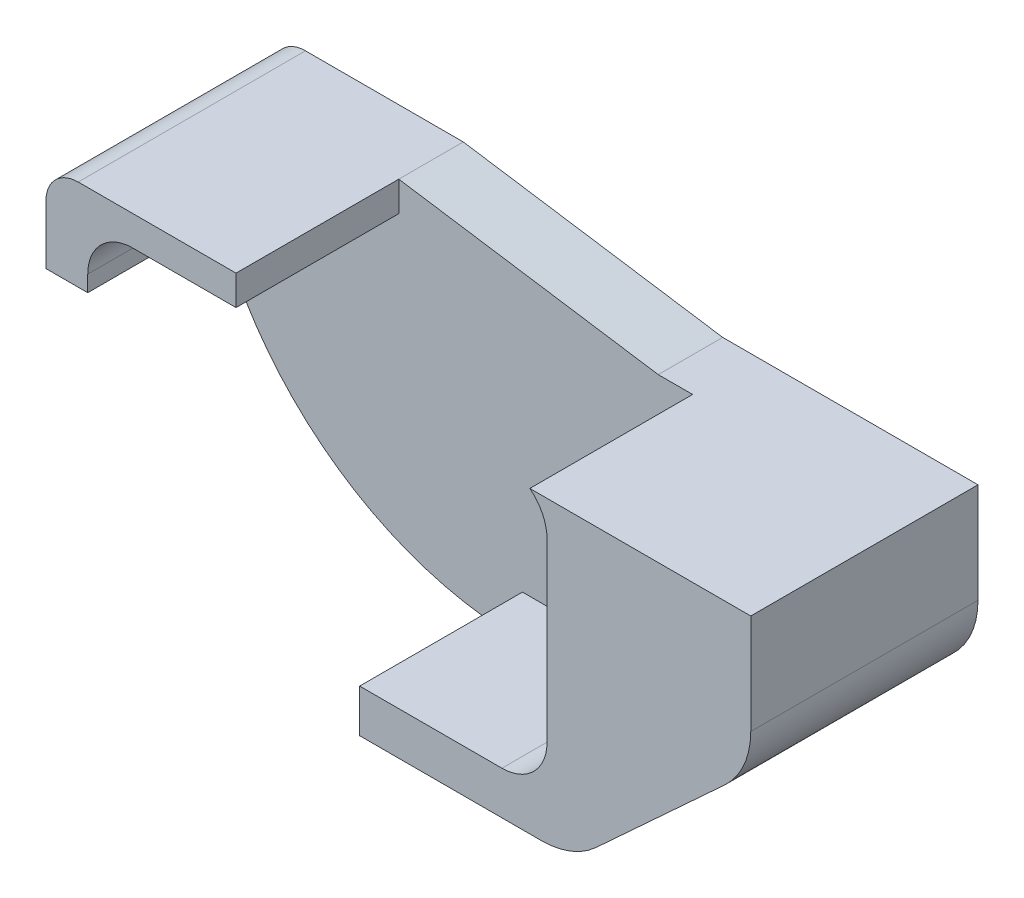
ISO-10303-21;
HEADER;
FILE_DESCRIPTION(('STEP AP214'),'2;1');
FILE_NAME('part.step','',(''),(''),'','','');
FILE_SCHEMA(('AUTOMOTIVE_DESIGN { 1 0 10303 214 1 1 1 1 }'));
ENDSEC;
DATA;
#1=APPLICATION_CONTEXT('core data for automotive mechanical design processes');
#2=APPLICATION_PROTOCOL_DEFINITION('international standard','automotive_design',2000,#1);
#3=PRODUCT_CONTEXT('',#1,'mechanical');
#4=PRODUCT('Part','Part','',(#3));
#5=PRODUCT_RELATED_PRODUCT_CATEGORY('part','',(#4));
#6=PRODUCT_DEFINITION_FORMATION('','',#4);
#7=PRODUCT_DEFINITION_CONTEXT('part definition',#1,'design');
#8=PRODUCT_DEFINITION('design','',#6,#7);
#9=PRODUCT_DEFINITION_SHAPE('','',#8);
#10=(LENGTH_UNIT() NAMED_UNIT(*) SI_UNIT(.MILLI.,.METRE.));
#11=(NAMED_UNIT(*) PLANE_ANGLE_UNIT() SI_UNIT($,.RADIAN.));
#12=(NAMED_UNIT(*) SI_UNIT($,.STERADIAN.) SOLID_ANGLE_UNIT());
#13=UNCERTAINTY_MEASURE_WITH_UNIT(LENGTH_MEASURE(1.E-05),#10,'distance_accuracy_value','');
#14=(GEOMETRIC_REPRESENTATION_CONTEXT(3) GLOBAL_UNCERTAINTY_ASSIGNED_CONTEXT((#13)) GLOBAL_UNIT_ASSIGNED_CONTEXT((#10,
#11,#12)) REPRESENTATION_CONTEXT('',''));
#15=CARTESIAN_POINT('',(0.,0.,0.));
#16=DIRECTION('',(0.,0.,1.));
#17=DIRECTION('',(1.,0.,0.));
#18=AXIS2_PLACEMENT_3D('',#15,#16,#17);
#19=CARTESIAN_POINT('',(-17.0761090873531,6.05763016242636,-4.));
#20=DIRECTION('',(0.,0.,-1.));
#21=DIRECTION('',(-1.,0.,0.));
#22=AXIS2_PLACEMENT_3D('',#19,#20,#21);
#23=CYLINDRICAL_SURFACE('',#22,1.7272);
#24=CARTESIAN_POINT('',(-17.0761090873531,6.05763016242636,-1.599999974));
#25=DIRECTION('',(0.,0.,-1.));
#26=DIRECTION('',(-1.,0.,0.));
#27=AXIS2_PLACEMENT_3D('',#24,#25,#26);
#28=CIRCLE('',#27,1.7272);
#29=CARTESIAN_POINT('',(-18.8033090873531,6.05763016242636,-1.599999974));
#30=VERTEX_POINT('',#29);
#31=EDGE_CURVE('E275',#30,#30,#28,.T.);
#32=ORIENTED_EDGE('',*,*,#31,.T.);
#33=EDGE_LOOP('',(#32));
#34=FACE_BOUND('',#33,.T.);
#35=CARTESIAN_POINT('',(-17.0761090873531,6.05763016242636,0.));
#36=DIRECTION('',(0.,0.,1.));
#37=DIRECTION('',(1.,0.,0.));
#38=AXIS2_PLACEMENT_3D('',#35,#36,#37);
#39=CIRCLE('',#38,1.7272);
#40=CARTESIAN_POINT('',(-15.3489090873531,6.05763016242636,0.));
#41=VERTEX_POINT('',#40);
#42=EDGE_CURVE('E279',#41,#41,#39,.T.);
#43=ORIENTED_EDGE('',*,*,#42,.T.);
#44=EDGE_LOOP('',(#43));
#45=FACE_BOUND('',#44,.T.);
#46=ADVANCED_FACE('F40',(#34,#45),#23,.F.);
#47=CARTESIAN_POINT('',(-3.20239410635002,9.8976981020209,-4.));
#48=DIRECTION('',(0.,0.,1.));
#49=DIRECTION('',(1.,0.,0.));
#50=AXIS2_PLACEMENT_3D('',#47,#48,#49);
#51=PLANE('',#50);
#52=CARTESIAN_POINT('',(5.42389091264691,-4.44236983757364,-4.));
#53=DIRECTION('',(0.,0.,-1.));
#54=DIRECTION('',(-1.,0.,0.));
#55=AXIS2_PLACEMENT_3D('',#52,#53,#54);
#56=CIRCLE('',#55,3.);
#57=CARTESIAN_POINT('',(2.42389091264691,-4.44236983757364,-4.));
#58=VERTEX_POINT('',#57);
#59=EDGE_CURVE('E283',#58,#58,#56,.T.);
#60=ORIENTED_EDGE('',*,*,#59,.F.);
#61=EDGE_LOOP('',(#60));
#62=FACE_BOUND('',#61,.T.);
#63=DIRECTION('',(0.,-1.,0.));
#64=VECTOR('',#63,1.);
#65=CARTESIAN_POINT('',(21.0644706390028,0.0572255815876549,-4.));
#66=LINE('',#65,#64);
#67=CARTESIAN_POINT('',(21.0644706390028,8.45763016242635,-4.));
#68=VERTEX_POINT('',#67);
#69=CARTESIAN_POINT('',(21.0644706390028,2.24988186453273,-4.));
#70=VERTEX_POINT('',#69);
#71=EDGE_CURVE('E345',#68,#70,#66,.T.);
#72=ORIENTED_EDGE('',*,*,#71,.T.);
#73=CARTESIAN_POINT('',(16.0644706390028,2.24988186453273,-4.));
#74=DIRECTION('',(0.,0.,1.));
#75=DIRECTION('',(1.,0.,0.));
#76=AXIS2_PLACEMENT_3D('',#73,#74,#75);
#77=CIRCLE('',#76,5.);
#78=CARTESIAN_POINT('',(19.451553550662,-1.42811614383347,-4.));
#79=VERTEX_POINT('',#78);
#80=EDGE_CURVE('E49',#70,#79,#77,.F.);
#81=ORIENTED_EDGE('',*,*,#80,.T.);
#82=DIRECTION('',(-0.73559960167324,-0.677416582331855,0.));
#83=VECTOR('',#82,1.);
#84=CARTESIAN_POINT('',(10.0227352664386,-10.1111521908867,-4.));
#85=LINE('',#84,#83);
#86=CARTESIAN_POINT('',(11.458283441403,-8.78915019925286,-4.));
#87=VERTEX_POINT('',#86);
#88=EDGE_CURVE('E348',#79,#87,#85,.T.);
#89=ORIENTED_EDGE('',*,*,#88,.T.);
#90=CARTESIAN_POINT('',(8.07120052974368,-5.11115219088665,-4.));
#91=DIRECTION('',(0.,0.,1.));
#92=DIRECTION('',(1.,0.,0.));
#93=AXIS2_PLACEMENT_3D('',#90,#91,#92);
#94=CIRCLE('',#93,5.);
#95=CARTESIAN_POINT('',(8.07120052974369,-10.1111521908867,-4.));
#96=VERTEX_POINT('',#95);
#97=EDGE_CURVE('E56',#87,#96,#94,.F.);
#98=ORIENTED_EDGE('',*,*,#97,.T.);
#99=DIRECTION('',(-1.,0.,0.));
#100=VECTOR('',#99,1.);
#101=CARTESIAN_POINT('',(-3.20239410635002,-10.1111521908866,-4.));
#102=LINE('',#101,#100);
#103=CARTESIAN_POINT('',(-3.20239410635002,-10.1111521908866,-4.));
#104=VERTEX_POINT('',#103);
#105=EDGE_CURVE('E351',#96,#104,#102,.T.);
#106=ORIENTED_EDGE('',*,*,#105,.T.);
#107=CARTESIAN_POINT('',(-3.20239410635002,9.8976981020209,-4.));
#108=DIRECTION('',(0.,0.,-1.));
#109=DIRECTION('',(1.,0.,0.));
#110=AXIS2_PLACEMENT_3D('',#107,#108,#109);
#111=CIRCLE('',#110,20.0088502929075);
#112=CARTESIAN_POINT('',(-22.6657920512088,5.25763016242633,-4.));
#113=VERTEX_POINT('',#112);
#114=EDGE_CURVE('E326',#104,#113,#111,.T.);
#115=ORIENTED_EDGE('',*,*,#114,.T.);
#116=DIRECTION('',(0.,1.,0.));
#117=VECTOR('',#116,1.);
#118=CARTESIAN_POINT('',(-22.6657920512088,10.9118128969897,-4.));
#119=LINE('',#118,#117);
#120=CARTESIAN_POINT('',(-22.6657920512088,8.91181289698967,-4.));
#121=VERTEX_POINT('',#120);
#122=EDGE_CURVE('E330',#113,#121,#119,.T.);
#123=ORIENTED_EDGE('',*,*,#122,.T.);
#124=CARTESIAN_POINT('',(-20.6657920512088,8.91181289698967,-4.));
#125=DIRECTION('',(0.,0.,1.));
#126=DIRECTION('',(1.,0.,0.));
#127=AXIS2_PLACEMENT_3D('',#124,#125,#126);
#128=CIRCLE('',#127,2.);
#129=CARTESIAN_POINT('',(-20.6657920512088,10.9118128969897,-4.));
#130=VERTEX_POINT('',#129);
#131=EDGE_CURVE('E423',#121,#130,#128,.F.);
#132=ORIENTED_EDGE('',*,*,#131,.T.);
#133=DIRECTION('',(1.,0.,0.));
#134=VECTOR('',#133,1.);
#135=CARTESIAN_POINT('',(-10.8754644499963,10.9118128969897,-4.));
#136=LINE('',#135,#134);
#137=CARTESIAN_POINT('',(-10.8754644499963,10.9118128969897,-4.));
#138=VERTEX_POINT('',#137);
#139=EDGE_CURVE('E335',#130,#138,#136,.T.);
#140=ORIENTED_EDGE('',*,*,#139,.T.);
#141=DIRECTION('',(0.988579708228122,-0.15069890669677,0.));
#142=VECTOR('',#141,1.);
#143=CARTESIAN_POINT('',(5.22389091264691,8.45763016242635,-4.));
#144=LINE('',#143,#142);
#145=CARTESIAN_POINT('',(5.22389091264691,8.45763016242635,-4.));
#146=VERTEX_POINT('',#145);
#147=EDGE_CURVE('E338',#138,#146,#144,.T.);
#148=ORIENTED_EDGE('',*,*,#147,.T.);
#149=DIRECTION('',(1.,0.,0.));
#150=VECTOR('',#149,1.);
#151=CARTESIAN_POINT('',(21.0644706390028,8.45763016242635,-4.));
#152=LINE('',#151,#150);
#153=EDGE_CURVE('E341',#146,#68,#152,.T.);
#154=ORIENTED_EDGE('',*,*,#153,.T.);
#155=EDGE_LOOP('',(#72,#81,#89,#98,#106,#115,#123,#132,#140,#148,#154));
#156=FACE_BOUND('',#155,.T.);
#157=CARTESIAN_POINT('',(-17.0761090873531,6.05763016242636,-4.));
#158=DIRECTION('',(0.,0.,-1.));
#159=DIRECTION('',(-1.,0.,0.));
#160=AXIS2_PLACEMENT_3D('',#157,#158,#159);
#161=CIRCLE('',#160,2.999999969);
#162=CARTESIAN_POINT('',(-20.0761090563531,6.05763016242636,-4.));
#163=VERTEX_POINT('',#162);
#164=EDGE_CURVE('E267',#163,#163,#161,.T.);
#165=ORIENTED_EDGE('',*,*,#164,.F.);
#166=EDGE_LOOP('',(#165));
#167=FACE_BOUND('',#166,.T.);
#168=ADVANCED_FACE('F445',(#62,#156,#167),#51,.F.);
#169=CARTESIAN_POINT('',(-3.20239410635002,9.8976981020209,0.));
#170=DIRECTION('',(0.,0.,1.));
#171=DIRECTION('',(1.,0.,0.));
#172=AXIS2_PLACEMENT_3D('',#169,#170,#171);
#173=PLANE('',#172);
#174=DIRECTION('',(0.,-1.,0.));
#175=VECTOR('',#174,1.);
#176=CARTESIAN_POINT('',(-3.20239410635002,-10.1111521908866,0.));
#177=LINE('',#176,#175);
#178=CARTESIAN_POINT('',(-3.20239410635002,-7.44236983757364,0.));
#179=VERTEX_POINT('',#178);
#180=CARTESIAN_POINT('',(-3.20239410635002,-10.1111521908866,0.));
#181=VERTEX_POINT('',#180);
#182=EDGE_CURVE('E378',#179,#181,#177,.T.);
#183=ORIENTED_EDGE('',*,*,#182,.F.);
#184=DIRECTION('',(1.,0.,0.));
#185=VECTOR('',#184,1.);
#186=CARTESIAN_POINT('',(-3.20239410635002,-7.44236983757364,0.));
#187=LINE('',#186,#185);
#188=CARTESIAN_POINT('',(5.62389091264689,-7.44236983757364,0.));
#189=VERTEX_POINT('',#188);
#190=EDGE_CURVE('E203',#179,#189,#187,.T.);
#191=ORIENTED_EDGE('',*,*,#190,.T.);
#192=CARTESIAN_POINT('',(5.62389091264691,-4.64236983757364,0.));
#193=DIRECTION('',(0.,0.,1.));
#194=DIRECTION('',(1.,0.,0.));
#195=AXIS2_PLACEMENT_3D('',#192,#193,#194);
#196=CIRCLE('',#195,2.8);
#197=CARTESIAN_POINT('',(8.42389091264691,-4.64236983757364,0.));
#198=VERTEX_POINT('',#197);
#199=EDGE_CURVE('E212',#198,#189,#196,.F.);
#200=ORIENTED_EDGE('',*,*,#199,.F.);
#201=DIRECTION('',(0.,-1.,0.));
#202=VECTOR('',#201,1.);
#203=CARTESIAN_POINT('',(8.42389091264691,5.25763016242633,0.));
#204=LINE('',#203,#202);
#205=CARTESIAN_POINT('',(8.42389091264691,6.25763016242634,0.));
#206=VERTEX_POINT('',#205);
#207=EDGE_CURVE('E388',#206,#198,#204,.T.);
#208=ORIENTED_EDGE('',*,*,#207,.F.);
#209=CARTESIAN_POINT('',(5.62389091264691,6.25763016242636,0.));
#210=DIRECTION('',(0.,0.,1.));
#211=DIRECTION('',(1.,0.,0.));
#212=AXIS2_PLACEMENT_3D('',#209,#210,#211);
#213=CIRCLE('',#212,2.8);
#214=CARTESIAN_POINT('',(7.35594172021581,8.45763016242634,0.));
#215=VERTEX_POINT('',#214);
#216=EDGE_CURVE('E465',#215,#206,#213,.F.);
#217=ORIENTED_EDGE('',*,*,#216,.F.);
#218=DIRECTION('',(1.,0.,0.));
#219=VECTOR('',#218,1.);
#220=CARTESIAN_POINT('',(21.0644706390028,8.45763016242634,0.));
#221=LINE('',#220,#219);
#222=CARTESIAN_POINT('',(5.22389091264691,8.45763016242635,0.));
#223=VERTEX_POINT('',#222);
#224=EDGE_CURVE('E251',#223,#215,#221,.T.);
#225=ORIENTED_EDGE('',*,*,#224,.F.);
#226=DIRECTION('',(0.988579708228122,-0.15069890669677,0.));
#227=VECTOR('',#226,1.);
#228=CARTESIAN_POINT('',(5.22389091264691,8.45763016242635,0.));
#229=LINE('',#228,#227);
#230=CARTESIAN_POINT('',(-10.8754644499963,10.9118128969897,0.));
#231=VERTEX_POINT('',#230);
#232=EDGE_CURVE('E331',#231,#223,#229,.T.);
#233=ORIENTED_EDGE('',*,*,#232,.F.);
#234=DIRECTION('',(0.,1.,0.));
#235=VECTOR('',#234,1.);
#236=CARTESIAN_POINT('',(-10.8754644499963,10.9118128969897,0.));
#237=LINE('',#236,#235);
#238=CARTESIAN_POINT('',(-10.8754644499963,9.05763016242636,0.));
#239=VERTEX_POINT('',#238);
#240=EDGE_CURVE('E312',#239,#231,#237,.T.);
#241=ORIENTED_EDGE('',*,*,#240,.F.);
#242=DIRECTION('',(1.,0.,0.));
#243=VECTOR('',#242,1.);
#244=CARTESIAN_POINT('',(5.62389091264689,9.05763016242636,0.));
#245=LINE('',#244,#243);
#246=CARTESIAN_POINT('',(-17.2761090873531,9.05763016242636,0.));
#247=VERTEX_POINT('',#246);
#248=EDGE_CURVE('E474',#247,#239,#245,.T.);
#249=ORIENTED_EDGE('',*,*,#248,.F.);
#250=CARTESIAN_POINT('',(-17.2761090873531,6.25763016242636,0.));
#251=DIRECTION('',(0.,0.,1.));
#252=DIRECTION('',(1.,0.,0.));
#253=AXIS2_PLACEMENT_3D('',#250,#251,#252);
#254=CIRCLE('',#253,2.8);
#255=CARTESIAN_POINT('',(-20.0761090873531,6.25763016242634,0.));
#256=VERTEX_POINT('',#255);
#257=EDGE_CURVE('E479',#256,#247,#254,.F.);
#258=ORIENTED_EDGE('',*,*,#257,.F.);
#259=DIRECTION('',(0.,1.,0.));
#260=VECTOR('',#259,1.);
#261=CARTESIAN_POINT('',(-20.0761090873531,-7.44236983757364,0.));
#262=LINE('',#261,#260);
#263=CARTESIAN_POINT('',(-20.0761090873531,5.25763016242632,0.));
#264=VERTEX_POINT('',#263);
#265=EDGE_CURVE('E256',#264,#256,#262,.T.);
#266=ORIENTED_EDGE('',*,*,#265,.F.);
#267=DIRECTION('',(1.,0.,0.));
#268=VECTOR('',#267,1.);
#269=CARTESIAN_POINT('',(-10.8754644499963,5.25763016242633,0.));
#270=LINE('',#269,#268);
#271=CARTESIAN_POINT('',(-22.6657920512088,5.25763016242632,0.));
#272=VERTEX_POINT('',#271);
#273=EDGE_CURVE('E300',#272,#264,#270,.T.);
#274=ORIENTED_EDGE('',*,*,#273,.F.);
#275=CARTESIAN_POINT('',(-3.20239410635002,9.8976981020209,0.));
#276=DIRECTION('',(0.,0.,-1.));
#277=DIRECTION('',(1.,0.,0.));
#278=AXIS2_PLACEMENT_3D('',#275,#276,#277);
#279=CIRCLE('',#278,20.0088502929075);
#280=EDGE_CURVE('E325',#181,#272,#279,.T.);
#281=ORIENTED_EDGE('',*,*,#280,.F.);
#282=EDGE_LOOP('',(#183,#191,#200,#208,#217,#225,#233,#241,#249,#258,#266,#274,#281));
#283=FACE_BOUND('',#282,.T.);
#284=ORIENTED_EDGE('',*,*,#42,.F.);
#285=EDGE_LOOP('',(#284));
#286=FACE_BOUND('',#285,.T.);
#287=CARTESIAN_POINT('',(5.42389091264691,-4.44236983757364,0.));
#288=DIRECTION('',(0.,0.,1.));
#289=DIRECTION('',(1.,0.,0.));
#290=AXIS2_PLACEMENT_3D('',#287,#288,#289);
#291=CIRCLE('',#290,1.7);
#292=CARTESIAN_POINT('',(7.12389091264691,-4.44236983757364,0.));
#293=VERTEX_POINT('',#292);
#294=EDGE_CURVE('E295',#293,#293,#291,.T.);
#295=ORIENTED_EDGE('',*,*,#294,.F.);
#296=EDGE_LOOP('',(#295));
#297=FACE_BOUND('',#296,.T.);
#298=ADVANCED_FACE('F469',(#283,#286,#297),#173,.T.);
#299=CARTESIAN_POINT('',(8.42389091264691,5.25763016242633,0.));
#300=DIRECTION('',(-1.,0.,0.));
#301=DIRECTION('',(0.,-1.,0.));
#302=AXIS2_PLACEMENT_3D('',#299,#300,#301);
#303=PLANE('',#302);
#304=ORIENTED_EDGE('',*,*,#207,.T.);
#305=DIRECTION('',(0.,0.,1.));
#306=VECTOR('',#305,1.);
#307=CARTESIAN_POINT('',(8.42389091264691,-4.64236983757362,-32.9317476001502));
#308=LINE('',#307,#306);
#309=CARTESIAN_POINT('',(8.42389091264691,-4.64236983757362,10.1));
#310=VERTEX_POINT('',#309);
#311=EDGE_CURVE('E214',#198,#310,#308,.T.);
#312=ORIENTED_EDGE('',*,*,#311,.T.);
#313=DIRECTION('',(0.,-1.,0.));
#314=VECTOR('',#313,1.);
#315=CARTESIAN_POINT('',(8.42389091264691,5.25763016242633,10.1));
#316=LINE('',#315,#314);
#317=CARTESIAN_POINT('',(8.42389091264691,6.25763016242634,10.1));
#318=VERTEX_POINT('',#317);
#319=EDGE_CURVE('E202',#318,#310,#316,.T.);
#320=ORIENTED_EDGE('',*,*,#319,.F.);
#321=DIRECTION('',(0.,0.,1.));
#322=VECTOR('',#321,1.);
#323=CARTESIAN_POINT('',(8.42389091264691,6.25763016242634,-32.9317476001502));
#324=LINE('',#323,#322);
#325=EDGE_CURVE('E245',#206,#318,#324,.T.);
#326=ORIENTED_EDGE('',*,*,#325,.F.);
#327=EDGE_LOOP('',(#304,#312,#320,#326));
#328=FACE_BOUND('',#327,.T.);
#329=ADVANCED_FACE('F467',(#328),#303,.T.);
#330=CARTESIAN_POINT('',(21.0644706390028,8.45763016242634,0.));
#331=DIRECTION('',(0.,1.,0.));
#332=DIRECTION('',(0.,0.,1.));
#333=AXIS2_PLACEMENT_3D('',#330,#331,#332);
#334=PLANE('',#333);
#335=DIRECTION('',(0.,0.,1.));
#336=VECTOR('',#335,1.);
#337=CARTESIAN_POINT('',(7.35594172021581,8.45763016242634,-32.9317476001502));
#338=LINE('',#337,#336);
#339=CARTESIAN_POINT('',(7.35594172021581,8.45763016242634,10.1));
#340=VERTEX_POINT('',#339);
#341=EDGE_CURVE('E264',#340,#215,#338,.F.);
#342=ORIENTED_EDGE('',*,*,#341,.F.);
#343=DIRECTION('',(-1.,0.,0.));
#344=VECTOR('',#343,1.);
#345=CARTESIAN_POINT('',(21.0644706390028,8.45763016242634,10.1));
#346=LINE('',#345,#344);
#347=CARTESIAN_POINT('',(21.0644706390028,8.45763016242634,10.1));
#348=VERTEX_POINT('',#347);
#349=EDGE_CURVE('E392',#348,#340,#346,.T.);
#350=ORIENTED_EDGE('',*,*,#349,.F.);
#351=DIRECTION('',(0.,0.,1.));
#352=VECTOR('',#351,1.);
#353=CARTESIAN_POINT('',(21.0644706390028,8.45763016242634,0.));
#354=LINE('',#353,#352);
#355=EDGE_CURVE('E391',#68,#348,#354,.T.);
#356=ORIENTED_EDGE('',*,*,#355,.F.);
#357=ORIENTED_EDGE('',*,*,#153,.F.);
#358=DIRECTION('',(0.,0.,1.));
#359=VECTOR('',#358,1.);
#360=CARTESIAN_POINT('',(5.22389091264691,8.45763016242635,-4.));
#361=LINE('',#360,#359);
#362=EDGE_CURVE('E361',#146,#223,#361,.T.);
#363=ORIENTED_EDGE('',*,*,#362,.T.);
#364=ORIENTED_EDGE('',*,*,#224,.T.);
#365=EDGE_LOOP('',(#342,#350,#356,#357,#363,#364));
#366=FACE_BOUND('',#365,.T.);
#367=ADVANCED_FACE('F459',(#366),#334,.T.);
#368=CARTESIAN_POINT('',(21.0644706390028,0.0572255815876534,0.));
#369=DIRECTION('',(1.,0.,0.));
#370=DIRECTION('',(0.,0.,-1.));
#371=AXIS2_PLACEMENT_3D('',#368,#369,#370);
#372=PLANE('',#371);
#373=DIRECTION('',(0.,1.,0.));
#374=VECTOR('',#373,1.);
#375=CARTESIAN_POINT('',(21.0644706390028,0.0572255815876534,10.1));
#376=LINE('',#375,#374);
#377=CARTESIAN_POINT('',(21.0644706390028,2.24988186453273,10.1));
#378=VERTEX_POINT('',#377);
#379=EDGE_CURVE('E403',#378,#348,#376,.T.);
#380=ORIENTED_EDGE('',*,*,#379,.F.);
#381=DIRECTION('',(0.,0.,1.));
#382=VECTOR('',#381,1.);
#383=CARTESIAN_POINT('',(21.0644706390028,2.24988186453273,0.));
#384=LINE('',#383,#382);
#385=EDGE_CURVE('E64',#378,#70,#384,.F.);
#386=ORIENTED_EDGE('',*,*,#385,.T.);
#387=ORIENTED_EDGE('',*,*,#71,.F.);
#388=ORIENTED_EDGE('',*,*,#355,.T.);
#389=EDGE_LOOP('',(#380,#386,#387,#388));
#390=FACE_BOUND('',#389,.T.);
#391=ADVANCED_FACE('F454',(#390),#372,.T.);
#392=CARTESIAN_POINT('',(10.0227352664386,-10.1111521908866,0.));
#393=DIRECTION('',(0.677416582331854,-0.73559960167324,0.));
#394=DIRECTION('',(0.73559960167324,0.677416582331854,0.));
#395=AXIS2_PLACEMENT_3D('',#392,#393,#394);
#396=PLANE('',#395);
#397=ORIENTED_EDGE('',*,*,#88,.F.);
#398=DIRECTION('',(0.,0.,1.));
#399=VECTOR('',#398,1.);
#400=CARTESIAN_POINT('',(19.451553550662,-1.42811614383347,0.));
#401=LINE('',#400,#399);
#402=CARTESIAN_POINT('',(19.451553550662,-1.42811614383347,10.1));
#403=VERTEX_POINT('',#402);
#404=EDGE_CURVE('E429',#79,#403,#401,.T.);
#405=ORIENTED_EDGE('',*,*,#404,.T.);
#406=DIRECTION('',(0.73559960167324,0.677416582331854,0.));
#407=VECTOR('',#406,1.);
#408=CARTESIAN_POINT('',(10.0227352664386,-10.1111521908866,10.1));
#409=LINE('',#408,#407);
#410=CARTESIAN_POINT('',(11.458283441403,-8.78915019925286,10.1));
#411=VERTEX_POINT('',#410);
#412=EDGE_CURVE('E399',#411,#403,#409,.T.);
#413=ORIENTED_EDGE('',*,*,#412,.F.);
#414=DIRECTION('',(0.,0.,1.));
#415=VECTOR('',#414,1.);
#416=CARTESIAN_POINT('',(11.458283441403,-8.78915019925286,0.));
#417=LINE('',#416,#415);
#418=EDGE_CURVE('E426',#411,#87,#417,.F.);
#419=ORIENTED_EDGE('',*,*,#418,.T.);
#420=EDGE_LOOP('',(#397,#405,#413,#419));
#421=FACE_BOUND('',#420,.T.);
#422=ADVANCED_FACE('F450',(#421),#396,.T.);
#423=CARTESIAN_POINT('',(8.42389091264689,-10.1111521908867,0.));
#424=DIRECTION('',(0.,-1.,0.));
#425=DIRECTION('',(1.,0.,0.));
#426=AXIS2_PLACEMENT_3D('',#423,#424,#425);
#427=PLANE('',#426);
#428=ORIENTED_EDGE('',*,*,#105,.F.);
#429=DIRECTION('',(0.,0.,1.));
#430=VECTOR('',#429,1.);
#431=CARTESIAN_POINT('',(8.07120052974369,-10.1111521908867,0.));
#432=LINE('',#431,#430);
#433=CARTESIAN_POINT('',(8.07120052974369,-10.1111521908867,10.1));
#434=VERTEX_POINT('',#433);
#435=EDGE_CURVE('E11',#96,#434,#432,.T.);
#436=ORIENTED_EDGE('',*,*,#435,.T.);
#437=DIRECTION('',(1.,0.,0.));
#438=VECTOR('',#437,1.);
#439=CARTESIAN_POINT('',(8.42389091264689,-10.1111521908867,10.1));
#440=LINE('',#439,#438);
#441=CARTESIAN_POINT('',(-3.20239410635002,-10.1111521908866,10.1));
#442=VERTEX_POINT('',#441);
#443=EDGE_CURVE('E395',#442,#434,#440,.T.);
#444=ORIENTED_EDGE('',*,*,#443,.F.);
#445=DIRECTION('',(0.,0.,1.));
#446=VECTOR('',#445,1.);
#447=CARTESIAN_POINT('',(-3.20239410635002,-10.1111521908866,10.1));
#448=LINE('',#447,#446);
#449=EDGE_CURVE('E382',#181,#442,#448,.T.);
#450=ORIENTED_EDGE('',*,*,#449,.F.);
#451=DIRECTION('',(0.,0.,1.));
#452=VECTOR('',#451,1.);
#453=CARTESIAN_POINT('',(-3.20239410635002,-10.1111521908866,-4.));
#454=LINE('',#453,#452);
#455=EDGE_CURVE('E354',#104,#181,#454,.T.);
#456=ORIENTED_EDGE('',*,*,#455,.F.);
#457=EDGE_LOOP('',(#428,#436,#444,#450,#456));
#458=FACE_BOUND('',#457,.T.);
#459=ADVANCED_FACE('F513',(#458),#427,.T.);
#460=CARTESIAN_POINT('',(5.2238909126469,5.25763016242634,10.1));
#461=DIRECTION('',(0.,0.,-1.));
#462=DIRECTION('',(-1.,0.,0.));
#463=AXIS2_PLACEMENT_3D('',#460,#461,#462);
#464=PLANE('',#463);
#465=ORIENTED_EDGE('',*,*,#349,.T.);
#466=CARTESIAN_POINT('',(5.62389091264691,6.25763016242636,10.1));
#467=DIRECTION('',(0.,0.,1.));
#468=DIRECTION('',(-1.,0.,0.));
#469=AXIS2_PLACEMENT_3D('',#466,#467,#468);
#470=CIRCLE('',#469,2.8);
#471=EDGE_CURVE('E222',#318,#340,#470,.T.);
#472=ORIENTED_EDGE('',*,*,#471,.F.);
#473=ORIENTED_EDGE('',*,*,#319,.T.);
#474=CARTESIAN_POINT('',(5.62389091264691,-4.64236983757364,10.1));
#475=DIRECTION('',(0.,0.,1.));
#476=DIRECTION('',(-1.,0.,0.));
#477=AXIS2_PLACEMENT_3D('',#474,#475,#476);
#478=CIRCLE('',#477,2.8);
#479=CARTESIAN_POINT('',(5.62389091264689,-7.44236983757364,10.1));
#480=VERTEX_POINT('',#479);
#481=EDGE_CURVE('E210',#480,#310,#478,.T.);
#482=ORIENTED_EDGE('',*,*,#481,.F.);
#483=DIRECTION('',(1.,0.,0.));
#484=VECTOR('',#483,1.);
#485=CARTESIAN_POINT('',(-3.20239410635002,-7.44236983757364,10.1));
#486=LINE('',#485,#484);
#487=CARTESIAN_POINT('',(-3.20239410635002,-7.44236983757364,10.1));
#488=VERTEX_POINT('',#487);
#489=EDGE_CURVE('E190',#488,#480,#486,.T.);
#490=ORIENTED_EDGE('',*,*,#489,.F.);
#491=DIRECTION('',(0.,1.,0.));
#492=VECTOR('',#491,1.);
#493=CARTESIAN_POINT('',(-3.20239410635002,-7.44236983757364,10.1));
#494=LINE('',#493,#492);
#495=EDGE_CURVE('E373',#442,#488,#494,.T.);
#496=ORIENTED_EDGE('',*,*,#495,.F.);
#497=ORIENTED_EDGE('',*,*,#443,.T.);
#498=CARTESIAN_POINT('',(8.07120052974368,-5.11115219088665,10.1));
#499=DIRECTION('',(0.,0.,-1.));
#500=DIRECTION('',(-1.,0.,0.));
#501=AXIS2_PLACEMENT_3D('',#498,#499,#500);
#502=CIRCLE('',#501,5.);
#503=EDGE_CURVE('E433',#434,#411,#502,.F.);
#504=ORIENTED_EDGE('',*,*,#503,.T.);
#505=ORIENTED_EDGE('',*,*,#412,.T.);
#506=CARTESIAN_POINT('',(16.0644706390028,2.24988186453273,10.1));
#507=DIRECTION('',(0.,0.,-1.));
#508=DIRECTION('',(-1.,0.,0.));
#509=AXIS2_PLACEMENT_3D('',#506,#507,#508);
#510=CIRCLE('',#509,5.);
#511=EDGE_CURVE('E436',#403,#378,#510,.F.);
#512=ORIENTED_EDGE('',*,*,#511,.T.);
#513=ORIENTED_EDGE('',*,*,#379,.T.);
#514=EDGE_LOOP('',(#465,#472,#473,#482,#490,#496,#497,#504,#505,#512,#513));
#515=FACE_BOUND('',#514,.T.);
#516=ADVANCED_FACE('F218',(#515),#464,.F.);
#517=CARTESIAN_POINT('',(-3.20239410635002,-7.44236983757364,0.));
#518=DIRECTION('',(0.,-1.,0.));
#519=DIRECTION('',(1.,0.,0.));
#520=AXIS2_PLACEMENT_3D('',#517,#518,#519);
#521=PLANE('',#520);
#522=ORIENTED_EDGE('',*,*,#489,.T.);
#523=DIRECTION('',(0.,0.,1.));
#524=VECTOR('',#523,1.);
#525=CARTESIAN_POINT('',(5.62389091264689,-7.44236983757364,-32.9317476001502));
#526=LINE('',#525,#524);
#527=EDGE_CURVE('E194',#189,#480,#526,.T.);
#528=ORIENTED_EDGE('',*,*,#527,.F.);
#529=ORIENTED_EDGE('',*,*,#190,.F.);
#530=DIRECTION('',(0.,0.,-1.));
#531=VECTOR('',#530,1.);
#532=CARTESIAN_POINT('',(-3.20239410635002,-7.44236983757364,0.));
#533=LINE('',#532,#531);
#534=EDGE_CURVE('E196',#488,#179,#533,.T.);
#535=ORIENTED_EDGE('',*,*,#534,.F.);
#536=EDGE_LOOP('',(#522,#528,#529,#535));
#537=FACE_BOUND('',#536,.T.);
#538=ADVANCED_FACE('F192',(#537),#521,.F.);
#539=CARTESIAN_POINT('',(-3.20239410635001,0.,0.));
#540=DIRECTION('',(1.,0.,0.));
#541=DIRECTION('',(0.,1.,0.));
#542=AXIS2_PLACEMENT_3D('',#539,#540,#541);
#543=PLANE('',#542);
#544=ORIENTED_EDGE('',*,*,#495,.T.);
#545=ORIENTED_EDGE('',*,*,#534,.T.);
#546=ORIENTED_EDGE('',*,*,#182,.T.);
#547=ORIENTED_EDGE('',*,*,#449,.T.);
#548=EDGE_LOOP('',(#544,#545,#546,#547));
#549=FACE_BOUND('',#548,.T.);
#550=ADVANCED_FACE('F516',(#549),#543,.F.);
#551=CARTESIAN_POINT('',(-3.20239410635002,9.8976981020209,-4.));
#552=DIRECTION('',(0.,0.,1.));
#553=DIRECTION('',(1.,0.,0.));
#554=AXIS2_PLACEMENT_3D('',#551,#552,#553);
#555=CYLINDRICAL_SURFACE('',#554,20.0088502929075);
#556=ORIENTED_EDGE('',*,*,#280,.T.);
#557=DIRECTION('',(0.,0.,1.));
#558=VECTOR('',#557,1.);
#559=CARTESIAN_POINT('',(-22.6657920512088,5.25763016242633,-4.));
#560=LINE('',#559,#558);
#561=EDGE_CURVE('E369',#113,#272,#560,.T.);
#562=ORIENTED_EDGE('',*,*,#561,.F.);
#563=ORIENTED_EDGE('',*,*,#114,.F.);
#564=ORIENTED_EDGE('',*,*,#455,.T.);
#565=EDGE_LOOP('',(#556,#562,#563,#564));
#566=FACE_BOUND('',#565,.T.);
#567=ADVANCED_FACE('F509',(#566),#555,.T.);
#568=CARTESIAN_POINT('',(-22.6657920512088,10.9118128969897,-4.));
#569=DIRECTION('',(1.,0.,0.));
#570=DIRECTION('',(0.,0.,-1.));
#571=AXIS2_PLACEMENT_3D('',#568,#569,#570);
#572=PLANE('',#571);
#573=DIRECTION('',(0.,-1.,0.));
#574=VECTOR('',#573,1.);
#575=CARTESIAN_POINT('',(-22.6657920512088,5.25763016242632,10.1));
#576=LINE('',#575,#574);
#577=CARTESIAN_POINT('',(-22.6657920512088,8.91181289698967,10.1));
#578=VERTEX_POINT('',#577);
#579=CARTESIAN_POINT('',(-22.6657920512088,5.25763016242632,10.1));
#580=VERTEX_POINT('',#579);
#581=EDGE_CURVE('E304',#578,#580,#576,.T.);
#582=ORIENTED_EDGE('',*,*,#581,.F.);
#583=DIRECTION('',(0.,0.,1.));
#584=VECTOR('',#583,1.);
#585=CARTESIAN_POINT('',(-22.6657920512088,8.91181289698967,-4.));
#586=LINE('',#585,#584);
#587=EDGE_CURVE('E420',#578,#121,#586,.F.);
#588=ORIENTED_EDGE('',*,*,#587,.T.);
#589=ORIENTED_EDGE('',*,*,#122,.F.);
#590=ORIENTED_EDGE('',*,*,#561,.T.);
#591=DIRECTION('',(0.,0.,-1.));
#592=VECTOR('',#591,1.);
#593=CARTESIAN_POINT('',(-22.6657920512088,5.25763016242632,10.1));
#594=LINE('',#593,#592);
#595=EDGE_CURVE('E311',#580,#272,#594,.T.);
#596=ORIENTED_EDGE('',*,*,#595,.F.);
#597=EDGE_LOOP('',(#582,#588,#589,#590,#596));
#598=FACE_BOUND('',#597,.T.);
#599=ADVANCED_FACE('F506',(#598),#572,.F.);
#600=CARTESIAN_POINT('',(-10.8754644499963,10.9118128969897,-4.));
#601=DIRECTION('',(0.,-1.,0.));
#602=DIRECTION('',(1.,0.,0.));
#603=AXIS2_PLACEMENT_3D('',#600,#601,#602);
#604=PLANE('',#603);
#605=ORIENTED_EDGE('',*,*,#139,.F.);
#606=DIRECTION('',(0.,0.,1.));
#607=VECTOR('',#606,1.);
#608=CARTESIAN_POINT('',(-20.6657920512088,10.9118128969897,-4.));
#609=LINE('',#608,#607);
#610=CARTESIAN_POINT('',(-20.6657920512088,10.9118128969897,10.1));
#611=VERTEX_POINT('',#610);
#612=EDGE_CURVE('E410',#130,#611,#609,.T.);
#613=ORIENTED_EDGE('',*,*,#612,.T.);
#614=DIRECTION('',(-1.,0.,0.));
#615=VECTOR('',#614,1.);
#616=CARTESIAN_POINT('',(-22.6657920512088,10.9118128969897,10.1));
#617=LINE('',#616,#615);
#618=CARTESIAN_POINT('',(-10.8754644499963,10.9118128969897,10.1));
#619=VERTEX_POINT('',#618);
#620=EDGE_CURVE('E299',#619,#611,#617,.T.);
#621=ORIENTED_EDGE('',*,*,#620,.F.);
#622=DIRECTION('',(0.,0.,-1.));
#623=VECTOR('',#622,1.);
#624=CARTESIAN_POINT('',(-10.8754644499963,10.9118128969897,10.1));
#625=LINE('',#624,#623);
#626=EDGE_CURVE('E321',#619,#231,#625,.T.);
#627=ORIENTED_EDGE('',*,*,#626,.T.);
#628=DIRECTION('',(0.,0.,1.));
#629=VECTOR('',#628,1.);
#630=CARTESIAN_POINT('',(-10.8754644499963,10.9118128969897,-4.));
#631=LINE('',#630,#629);
#632=EDGE_CURVE('E365',#138,#231,#631,.T.);
#633=ORIENTED_EDGE('',*,*,#632,.F.);
#634=EDGE_LOOP('',(#605,#613,#621,#627,#633));
#635=FACE_BOUND('',#634,.T.);
#636=ADVANCED_FACE('F564',(#635),#604,.F.);
#637=CARTESIAN_POINT('',(5.22389091264691,8.45763016242635,-4.));
#638=DIRECTION('',(-0.15069890669677,-0.988579708228122,0.));
#639=DIRECTION('',(0.988579708228122,-0.15069890669677,0.));
#640=AXIS2_PLACEMENT_3D('',#637,#638,#639);
#641=PLANE('',#640);
#642=ORIENTED_EDGE('',*,*,#232,.T.);
#643=ORIENTED_EDGE('',*,*,#362,.F.);
#644=ORIENTED_EDGE('',*,*,#147,.F.);
#645=ORIENTED_EDGE('',*,*,#632,.T.);
#646=EDGE_LOOP('',(#642,#643,#644,#645));
#647=FACE_BOUND('',#646,.T.);
#648=ADVANCED_FACE('F557',(#647),#641,.F.);
#649=CARTESIAN_POINT('',(-10.8754644499963,10.9118128969897,10.1));
#650=DIRECTION('',(-1.,0.,0.));
#651=DIRECTION('',(0.,0.,1.));
#652=AXIS2_PLACEMENT_3D('',#649,#650,#651);
#653=PLANE('',#652);
#654=DIRECTION('',(0.,1.,0.));
#655=VECTOR('',#654,1.);
#656=CARTESIAN_POINT('',(-10.8754644499963,10.9118128969897,10.1));
#657=LINE('',#656,#655);
#658=CARTESIAN_POINT('',(-10.8754644499963,9.05763016242636,10.1));
#659=VERTEX_POINT('',#658);
#660=EDGE_CURVE('E296',#659,#619,#657,.T.);
#661=ORIENTED_EDGE('',*,*,#660,.F.);
#662=DIRECTION('',(0.,0.,-1.));
#663=VECTOR('',#662,1.);
#664=CARTESIAN_POINT('',(-10.8754644499963,9.05763016242636,10.1));
#665=LINE('',#664,#663);
#666=EDGE_CURVE('E255',#659,#239,#665,.T.);
#667=ORIENTED_EDGE('',*,*,#666,.T.);
#668=ORIENTED_EDGE('',*,*,#240,.T.);
#669=ORIENTED_EDGE('',*,*,#626,.F.);
#670=EDGE_LOOP('',(#661,#667,#668,#669));
#671=FACE_BOUND('',#670,.T.);
#672=ADVANCED_FACE('F555',(#671),#653,.F.);
#673=CARTESIAN_POINT('',(-10.8754644499963,5.25763016242633,10.1));
#674=DIRECTION('',(0.,1.,0.));
#675=DIRECTION('',(-1.,0.,0.));
#676=AXIS2_PLACEMENT_3D('',#673,#674,#675);
#677=PLANE('',#676);
#678=ORIENTED_EDGE('',*,*,#273,.T.);
#679=DIRECTION('',(0.,0.,1.));
#680=VECTOR('',#679,1.);
#681=CARTESIAN_POINT('',(-20.0761090873531,5.25763016242632,10.1));
#682=LINE('',#681,#680);
#683=CARTESIAN_POINT('',(-20.0761090873531,5.25763016242632,10.1));
#684=VERTEX_POINT('',#683);
#685=EDGE_CURVE('E260',#264,#684,#682,.T.);
#686=ORIENTED_EDGE('',*,*,#685,.T.);
#687=DIRECTION('',(1.,0.,0.));
#688=VECTOR('',#687,1.);
#689=CARTESIAN_POINT('',(-10.8754644499963,5.25763016242633,10.1));
#690=LINE('',#689,#688);
#691=EDGE_CURVE('E307',#580,#684,#690,.T.);
#692=ORIENTED_EDGE('',*,*,#691,.F.);
#693=ORIENTED_EDGE('',*,*,#595,.T.);
#694=EDGE_LOOP('',(#678,#686,#692,#693));
#695=FACE_BOUND('',#694,.T.);
#696=ADVANCED_FACE('F500',(#695),#677,.F.);
#697=CARTESIAN_POINT('',(0.,0.,10.1));
#698=DIRECTION('',(0.,0.,-1.));
#699=DIRECTION('',(-1.,0.,0.));
#700=AXIS2_PLACEMENT_3D('',#697,#698,#699);
#701=PLANE('',#700);
#702=ORIENTED_EDGE('',*,*,#691,.T.);
#703=DIRECTION('',(0.,-1.,0.));
#704=VECTOR('',#703,1.);
#705=CARTESIAN_POINT('',(-20.0761090873531,-7.44236983757364,10.1));
#706=LINE('',#705,#704);
#707=CARTESIAN_POINT('',(-20.0761090873531,6.25763016242634,10.1));
#708=VERTEX_POINT('',#707);
#709=EDGE_CURVE('E223',#708,#684,#706,.T.);
#710=ORIENTED_EDGE('',*,*,#709,.F.);
#711=CARTESIAN_POINT('',(-17.2761090873531,6.25763016242636,10.1));
#712=DIRECTION('',(0.,0.,1.));
#713=DIRECTION('',(1.,0.,0.));
#714=AXIS2_PLACEMENT_3D('',#711,#712,#713);
#715=CIRCLE('',#714,2.8);
#716=CARTESIAN_POINT('',(-17.2761090873531,9.05763016242636,10.1));
#717=VERTEX_POINT('',#716);
#718=EDGE_CURVE('E215',#717,#708,#715,.T.);
#719=ORIENTED_EDGE('',*,*,#718,.F.);
#720=DIRECTION('',(-1.,0.,0.));
#721=VECTOR('',#720,1.);
#722=CARTESIAN_POINT('',(5.62389091264689,9.05763016242636,10.1));
#723=LINE('',#722,#721);
#724=EDGE_CURVE('E228',#659,#717,#723,.T.);
#725=ORIENTED_EDGE('',*,*,#724,.F.);
#726=ORIENTED_EDGE('',*,*,#660,.T.);
#727=ORIENTED_EDGE('',*,*,#620,.T.);
#728=CARTESIAN_POINT('',(-20.6657920512088,8.91181289698967,10.1));
#729=DIRECTION('',(0.,0.,-1.));
#730=DIRECTION('',(-1.,0.,0.));
#731=AXIS2_PLACEMENT_3D('',#728,#729,#730);
#732=CIRCLE('',#731,2.);
#733=EDGE_CURVE('E417',#611,#578,#732,.F.);
#734=ORIENTED_EDGE('',*,*,#733,.T.);
#735=ORIENTED_EDGE('',*,*,#581,.T.);
#736=EDGE_LOOP('',(#702,#710,#719,#725,#726,#727,#734,#735));
#737=FACE_BOUND('',#736,.T.);
#738=ADVANCED_FACE('F497',(#737),#701,.F.);
#739=CARTESIAN_POINT('',(5.42389091264691,-4.44236983757364,-4.));
#740=DIRECTION('',(0.,0.,-1.));
#741=DIRECTION('',(-1.,0.,0.));
#742=AXIS2_PLACEMENT_3D('',#739,#740,#741);
#743=CYLINDRICAL_SURFACE('',#742,1.7);
#744=ORIENTED_EDGE('',*,*,#294,.T.);
#745=EDGE_LOOP('',(#744));
#746=FACE_BOUND('',#745,.T.);
#747=CARTESIAN_POINT('',(5.42389091264691,-4.44236983757364,-1.6));
#748=DIRECTION('',(0.,0.,-1.));
#749=DIRECTION('',(-1.,0.,0.));
#750=AXIS2_PLACEMENT_3D('',#747,#748,#749);
#751=CIRCLE('',#750,1.7);
#752=CARTESIAN_POINT('',(3.72389091264691,-4.44236983757364,-1.6));
#753=VERTEX_POINT('',#752);
#754=EDGE_CURVE('E291',#753,#753,#751,.T.);
#755=ORIENTED_EDGE('',*,*,#754,.T.);
#756=EDGE_LOOP('',(#755));
#757=FACE_BOUND('',#756,.T.);
#758=ADVANCED_FACE('F546',(#746,#757),#743,.F.);
#759=CARTESIAN_POINT('',(7.12389091264691,-4.44236983757364,-1.6));
#760=DIRECTION('',(0.,0.,1.));
#761=DIRECTION('',(1.,0.,0.));
#762=AXIS2_PLACEMENT_3D('',#759,#760,#761);
#763=PLANE('',#762);
#764=ORIENTED_EDGE('',*,*,#754,.F.);
#765=EDGE_LOOP('',(#764));
#766=FACE_BOUND('',#765,.T.);
#767=CARTESIAN_POINT('',(5.42389091264691,-4.44236983757364,-1.6));
#768=DIRECTION('',(0.,0.,-1.));
#769=DIRECTION('',(-1.,0.,0.));
#770=AXIS2_PLACEMENT_3D('',#767,#768,#769);
#771=CIRCLE('',#770,3.);
#772=CARTESIAN_POINT('',(2.42389091264691,-4.44236983757364,-1.6));
#773=VERTEX_POINT('',#772);
#774=EDGE_CURVE('E287',#773,#773,#771,.T.);
#775=ORIENTED_EDGE('',*,*,#774,.T.);
#776=EDGE_LOOP('',(#775));
#777=FACE_BOUND('',#776,.T.);
#778=ADVANCED_FACE('F542',(#766,#777),#763,.F.);
#779=CARTESIAN_POINT('',(5.42389091264691,-4.44236983757364,-4.));
#780=DIRECTION('',(0.,0.,-1.));
#781=DIRECTION('',(-1.,0.,0.));
#782=AXIS2_PLACEMENT_3D('',#779,#780,#781);
#783=CYLINDRICAL_SURFACE('',#782,3.);
#784=ORIENTED_EDGE('',*,*,#774,.F.);
#785=EDGE_LOOP('',(#784));
#786=FACE_BOUND('',#785,.T.);
#787=ORIENTED_EDGE('',*,*,#59,.T.);
#788=EDGE_LOOP('',(#787));
#789=FACE_BOUND('',#788,.T.);
#790=ADVANCED_FACE('F539',(#786,#789),#783,.F.);
#791=CARTESIAN_POINT('',(-15.3489090873531,6.05763016242636,-1.599999974));
#792=DIRECTION('',(0.,0.,1.));
#793=DIRECTION('',(1.,0.,0.));
#794=AXIS2_PLACEMENT_3D('',#791,#792,#793);
#795=PLANE('',#794);
#796=ORIENTED_EDGE('',*,*,#31,.F.);
#797=EDGE_LOOP('',(#796));
#798=FACE_BOUND('',#797,.T.);
#799=CARTESIAN_POINT('',(-17.0761090873531,6.05763016242636,-1.599999974));
#800=DIRECTION('',(0.,0.,-1.));
#801=DIRECTION('',(-1.,0.,0.));
#802=AXIS2_PLACEMENT_3D('',#799,#800,#801);
#803=CIRCLE('',#802,2.999999969);
#804=CARTESIAN_POINT('',(-20.0761090563531,6.05763016242636,-1.599999974));
#805=VERTEX_POINT('',#804);
#806=EDGE_CURVE('E271',#805,#805,#803,.T.);
#807=ORIENTED_EDGE('',*,*,#806,.T.);
#808=EDGE_LOOP('',(#807));
#809=FACE_BOUND('',#808,.T.);
#810=ADVANCED_FACE('F537',(#798,#809),#795,.F.);
#811=CARTESIAN_POINT('',(-17.0761090873531,6.05763016242636,-4.));
#812=DIRECTION('',(0.,0.,-1.));
#813=DIRECTION('',(-1.,0.,0.));
#814=AXIS2_PLACEMENT_3D('',#811,#812,#813);
#815=CYLINDRICAL_SURFACE('',#814,2.999999969);
#816=ORIENTED_EDGE('',*,*,#806,.F.);
#817=EDGE_LOOP('',(#816));
#818=FACE_BOUND('',#817,.T.);
#819=ORIENTED_EDGE('',*,*,#164,.T.);
#820=EDGE_LOOP('',(#819));
#821=FACE_BOUND('',#820,.T.);
#822=ADVANCED_FACE('F590',(#818,#821),#815,.F.);
#823=CARTESIAN_POINT('',(-20.6657920512088,8.91181289698967,-4.));
#824=DIRECTION('',(0.,0.,1.));
#825=DIRECTION('',(1.,0.,0.));
#826=AXIS2_PLACEMENT_3D('',#823,#824,#825);
#827=CYLINDRICAL_SURFACE('',#826,2.);
#828=ORIENTED_EDGE('',*,*,#131,.F.);
#829=ORIENTED_EDGE('',*,*,#587,.F.);
#830=ORIENTED_EDGE('',*,*,#733,.F.);
#831=ORIENTED_EDGE('',*,*,#612,.F.);
#832=EDGE_LOOP('',(#828,#829,#830,#831));
#833=FACE_BOUND('',#832,.T.);
#834=ADVANCED_FACE('F525',(#833),#827,.T.);
#835=CARTESIAN_POINT('',(16.0644706390028,2.24988186453273,0.));
#836=DIRECTION('',(0.,0.,1.));
#837=DIRECTION('',(1.,0.,0.));
#838=AXIS2_PLACEMENT_3D('',#835,#836,#837);
#839=CYLINDRICAL_SURFACE('',#838,5.);
#840=ORIENTED_EDGE('',*,*,#80,.F.);
#841=ORIENTED_EDGE('',*,*,#385,.F.);
#842=ORIENTED_EDGE('',*,*,#511,.F.);
#843=ORIENTED_EDGE('',*,*,#404,.F.);
#844=EDGE_LOOP('',(#840,#841,#842,#843));
#845=FACE_BOUND('',#844,.T.);
#846=ADVANCED_FACE('F453',(#845),#839,.T.);
#847=CARTESIAN_POINT('',(8.07120052974368,-5.11115219088665,0.));
#848=DIRECTION('',(0.,0.,1.));
#849=DIRECTION('',(1.,0.,0.));
#850=AXIS2_PLACEMENT_3D('',#847,#848,#849);
#851=CYLINDRICAL_SURFACE('',#850,5.);
#852=ORIENTED_EDGE('',*,*,#97,.F.);
#853=ORIENTED_EDGE('',*,*,#418,.F.);
#854=ORIENTED_EDGE('',*,*,#503,.F.);
#855=ORIENTED_EDGE('',*,*,#435,.F.);
#856=EDGE_LOOP('',(#852,#853,#854,#855));
#857=FACE_BOUND('',#856,.T.);
#858=ADVANCED_FACE('F42',(#857),#851,.T.);
#859=CARTESIAN_POINT('',(5.62389091264691,-4.64236983757364,-32.9317476001502));
#860=DIRECTION('',(0.,0.,1.));
#861=DIRECTION('',(1.,0.,0.));
#862=AXIS2_PLACEMENT_3D('',#859,#860,#861);
#863=CYLINDRICAL_SURFACE('',#862,2.8);
#864=ORIENTED_EDGE('',*,*,#199,.T.);
#865=ORIENTED_EDGE('',*,*,#527,.T.);
#866=ORIENTED_EDGE('',*,*,#481,.T.);
#867=ORIENTED_EDGE('',*,*,#311,.F.);
#868=EDGE_LOOP('',(#864,#865,#866,#867));
#869=FACE_BOUND('',#868,.T.);
#870=ADVANCED_FACE('F208',(#869),#863,.F.);
#871=CARTESIAN_POINT('',(5.62389091264689,9.05763016242636,-32.9317476001502));
#872=DIRECTION('',(0.,1.,0.));
#873=DIRECTION('',(-1.,0.,0.));
#874=AXIS2_PLACEMENT_3D('',#871,#872,#873);
#875=PLANE('',#874);
#876=ORIENTED_EDGE('',*,*,#724,.T.);
#877=DIRECTION('',(0.,0.,1.));
#878=VECTOR('',#877,1.);
#879=CARTESIAN_POINT('',(-17.2761090873531,9.05763016242636,-32.9317476001502));
#880=LINE('',#879,#878);
#881=EDGE_CURVE('E241',#247,#717,#880,.T.);
#882=ORIENTED_EDGE('',*,*,#881,.F.);
#883=ORIENTED_EDGE('',*,*,#248,.T.);
#884=ORIENTED_EDGE('',*,*,#666,.F.);
#885=EDGE_LOOP('',(#876,#882,#883,#884));
#886=FACE_BOUND('',#885,.T.);
#887=ADVANCED_FACE('F523',(#886),#875,.F.);
#888=CARTESIAN_POINT('',(-17.2761090873531,6.25763016242636,-32.9317476001502));
#889=DIRECTION('',(0.,0.,1.));
#890=DIRECTION('',(1.,0.,0.));
#891=AXIS2_PLACEMENT_3D('',#888,#889,#890);
#892=CYLINDRICAL_SURFACE('',#891,2.8);
#893=ORIENTED_EDGE('',*,*,#257,.T.);
#894=ORIENTED_EDGE('',*,*,#881,.T.);
#895=ORIENTED_EDGE('',*,*,#718,.T.);
#896=DIRECTION('',(0.,0.,1.));
#897=VECTOR('',#896,1.);
#898=CARTESIAN_POINT('',(-20.0761090873531,6.25763016242634,-32.9317476001502));
#899=LINE('',#898,#897);
#900=EDGE_CURVE('E238',#256,#708,#899,.T.);
#901=ORIENTED_EDGE('',*,*,#900,.F.);
#902=EDGE_LOOP('',(#893,#894,#895,#901));
#903=FACE_BOUND('',#902,.T.);
#904=ADVANCED_FACE('F492',(#903),#892,.F.);
#905=CARTESIAN_POINT('',(-20.0761090873531,-7.44236983757364,-32.9317476001502));
#906=DIRECTION('',(-1.,0.,0.));
#907=DIRECTION('',(0.,0.,1.));
#908=AXIS2_PLACEMENT_3D('',#905,#906,#907);
#909=PLANE('',#908);
#910=ORIENTED_EDGE('',*,*,#265,.T.);
#911=ORIENTED_EDGE('',*,*,#900,.T.);
#912=ORIENTED_EDGE('',*,*,#709,.T.);
#913=ORIENTED_EDGE('',*,*,#685,.F.);
#914=EDGE_LOOP('',(#910,#911,#912,#913));
#915=FACE_BOUND('',#914,.T.);
#916=ADVANCED_FACE('F485',(#915),#909,.F.);
#917=CARTESIAN_POINT('',(5.62389091264691,6.25763016242636,-32.9317476001502));
#918=DIRECTION('',(0.,0.,1.));
#919=DIRECTION('',(1.,0.,0.));
#920=AXIS2_PLACEMENT_3D('',#917,#918,#919);
#921=CYLINDRICAL_SURFACE('',#920,2.8);
#922=ORIENTED_EDGE('',*,*,#341,.T.);
#923=ORIENTED_EDGE('',*,*,#216,.T.);
#924=ORIENTED_EDGE('',*,*,#325,.T.);
#925=ORIENTED_EDGE('',*,*,#471,.T.);
#926=EDGE_LOOP('',(#922,#923,#924,#925));
#927=FACE_BOUND('',#926,.T.);
#928=ADVANCED_FACE('F461',(#927),#921,.F.);
#929=CLOSED_SHELL('',(#46,#168,#298,#329,#367,#391,#422,#459,#516,#538,#550,#567,#599,#636,#648,
#672,#696,#738,#758,#778,#790,#810,#822,#834,#846,#858,#870,#887,#904,#916,#928));
#930=MANIFOLD_SOLID_BREP('B2',#929);
#931=ADVANCED_BREP_SHAPE_REPRESENTATION('',(#18,#930),#14);
#932=SHAPE_DEFINITION_REPRESENTATION(#9,#931);
ENDSEC;
END-ISO-10303-21;
